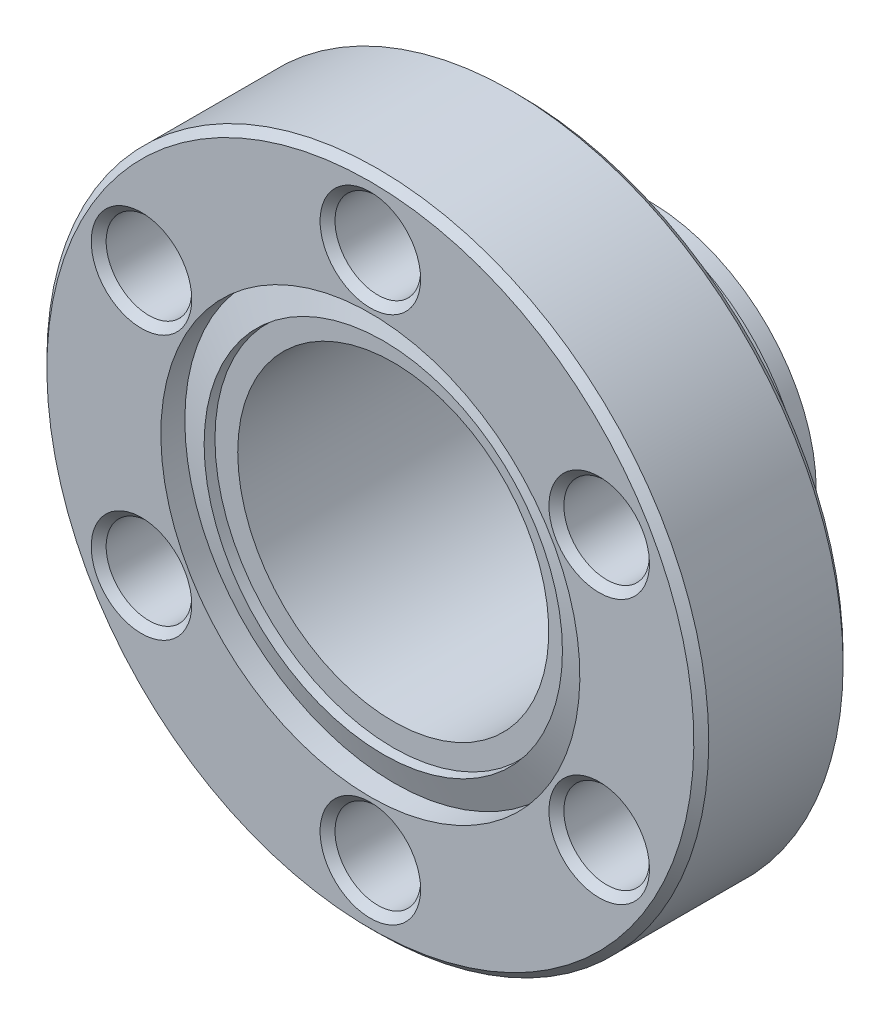
ISO-10303-21;
HEADER;
FILE_DESCRIPTION(('STEP AP214'),'2;1');
FILE_NAME('part.step','',(''),(''),'','','');
FILE_SCHEMA(('AUTOMOTIVE_DESIGN { 1 0 10303 214 1 1 1 1 }'));
ENDSEC;
DATA;
#1=APPLICATION_CONTEXT('core data for automotive mechanical design processes');
#2=APPLICATION_PROTOCOL_DEFINITION('international standard','automotive_design',2000,#1);
#3=PRODUCT_CONTEXT('',#1,'mechanical');
#4=PRODUCT('Part','Part','',(#3));
#5=PRODUCT_RELATED_PRODUCT_CATEGORY('part','',(#4));
#6=PRODUCT_DEFINITION_FORMATION('','',#4);
#7=PRODUCT_DEFINITION_CONTEXT('part definition',#1,'design');
#8=PRODUCT_DEFINITION('design','',#6,#7);
#9=PRODUCT_DEFINITION_SHAPE('','',#8);
#10=(LENGTH_UNIT() NAMED_UNIT(*) SI_UNIT(.MILLI.,.METRE.));
#11=(NAMED_UNIT(*) PLANE_ANGLE_UNIT() SI_UNIT($,.RADIAN.));
#12=(NAMED_UNIT(*) SI_UNIT($,.STERADIAN.) SOLID_ANGLE_UNIT());
#13=UNCERTAINTY_MEASURE_WITH_UNIT(LENGTH_MEASURE(1.E-05),#10,'distance_accuracy_value','');
#14=(GEOMETRIC_REPRESENTATION_CONTEXT(3) GLOBAL_UNCERTAINTY_ASSIGNED_CONTEXT((#13)) GLOBAL_UNIT_ASSIGNED_CONTEXT((#10,
#11,#12)) REPRESENTATION_CONTEXT('',''));
#15=CARTESIAN_POINT('',(0.,0.,0.));
#16=DIRECTION('',(0.,0.,1.));
#17=DIRECTION('',(1.,0.,0.));
#18=AXIS2_PLACEMENT_3D('',#15,#16,#17);
#19=CARTESIAN_POINT('',(0.,125.,106.381600000004));
#20=DIRECTION('',(0.,0.,1.));
#21=DIRECTION('',(1.,0.,0.));
#22=AXIS2_PLACEMENT_3D('',#19,#20,#21);
#23=CONICAL_SURFACE('',#22,9.09955575892884,0.0872664626014899);
#24=CARTESIAN_POINT('',(0.,125.,106.889599999987));
#25=DIRECTION('',(0.,0.,1.));
#26=DIRECTION('',(-1.,0.,0.));
#27=AXIS2_PLACEMENT_3D('',#24,#25,#26);
#28=CIRCLE('',#27,9.14399999999961);
#29=CARTESIAN_POINT('',(-9.14399999999961,125.,106.889599999987));
#30=VERTEX_POINT('',#29);
#31=EDGE_CURVE('E30',#30,#30,#28,.T.);
#32=ORIENTED_EDGE('',*,*,#31,.T.);
#33=EDGE_LOOP('',(#32));
#34=FACE_BOUND('',#33,.T.);
#35=CARTESIAN_POINT('',(0.,125.,106.381600000004));
#36=DIRECTION('',(0.,0.,1.));
#37=DIRECTION('',(1.,0.,0.));
#38=AXIS2_PLACEMENT_3D('',#35,#36,#37);
#39=CIRCLE('',#38,9.09955575892884);
#40=CARTESIAN_POINT('',(9.09955575892884,125.,106.381600000004));
#41=VERTEX_POINT('',#40);
#42=EDGE_CURVE('E18',#41,#41,#39,.T.);
#43=ORIENTED_EDGE('',*,*,#42,.F.);
#44=EDGE_LOOP('',(#43));
#45=FACE_BOUND('',#44,.T.);
#46=ADVANCED_FACE('F14',(#34,#45),#23,.F.);
#47=CARTESIAN_POINT('',(0.,125.,106.325664519013));
#48=DIRECTION('',(0.,0.,-1.));
#49=DIRECTION('',(-1.,0.,0.));
#50=AXIS2_PLACEMENT_3D('',#47,#48,#49);
#51=CONICAL_SURFACE('',#50,10.6934000000004,1.22173047639554);
#52=CARTESIAN_POINT('',(0.,125.,106.325664519065));
#53=DIRECTION('',(0.,0.,1.));
#54=DIRECTION('',(-1.,0.,0.));
#55=AXIS2_PLACEMENT_3D('',#52,#53,#54);
#56=CIRCLE('',#55,10.6934);
#57=CARTESIAN_POINT('',(-10.6934,125.,106.325664519065));
#58=VERTEX_POINT('',#57);
#59=EDGE_CURVE('E91',#58,#58,#56,.F.);
#60=ORIENTED_EDGE('',*,*,#59,.F.);
#61=EDGE_LOOP('',(#60));
#62=FACE_BOUND('',#61,.T.);
#63=ORIENTED_EDGE('',*,*,#31,.F.);
#64=EDGE_LOOP('',(#63));
#65=FACE_BOUND('',#64,.T.);
#66=ADVANCED_FACE('F432',(#62,#65),#51,.T.);
#67=CARTESIAN_POINT('',(9.463537989286,134.4635379893,106.3816));
#68=DIRECTION('',(0.,0.,1.));
#69=DIRECTION('',(-1.,0.,0.));
#70=AXIS2_PLACEMENT_3D('',#67,#68,#69);
#71=PLANE('',#70);
#72=CARTESIAN_POINT('',(0.,125.,106.3816));
#73=DIRECTION('',(0.,0.,-1.));
#74=DIRECTION('',(-1.,0.,0.));
#75=AXIS2_PLACEMENT_3D('',#72,#73,#74);
#76=CIRCLE('',#75,7.9375);
#77=CARTESIAN_POINT('',(-7.9375,125.,106.3816));
#78=VERTEX_POINT('',#77);
#79=EDGE_CURVE('E89',#78,#78,#76,.F.);
#80=ORIENTED_EDGE('',*,*,#79,.F.);
#81=EDGE_LOOP('',(#80));
#82=FACE_BOUND('',#81,.T.);
#83=ORIENTED_EDGE('',*,*,#42,.T.);
#84=EDGE_LOOP('',(#83));
#85=FACE_BOUND('',#84,.T.);
#86=ADVANCED_FACE('F424',(#82,#85),#71,.T.);
#87=CARTESIAN_POINT('',(0.,125.,106.325664519065));
#88=DIRECTION('',(0.,0.,1.));
#89=DIRECTION('',(0.,-1.,0.));
#90=AXIS2_PLACEMENT_3D('',#87,#88,#89);
#91=CYLINDRICAL_SURFACE('',#90,10.6934);
#92=ORIENTED_EDGE('',*,*,#59,.T.);
#93=EDGE_LOOP('',(#92));
#94=FACE_BOUND('',#93,.T.);
#95=CARTESIAN_POINT('',(0.,125.,107.550000000035));
#96=DIRECTION('',(0.,0.,1.));
#97=DIRECTION('',(0.,-1.,0.));
#98=AXIS2_PLACEMENT_3D('',#95,#96,#97);
#99=CIRCLE('',#98,10.6934);
#100=CARTESIAN_POINT('',(0.,114.3066,107.550000000035));
#101=VERTEX_POINT('',#100);
#102=EDGE_CURVE('E87',#101,#101,#99,.F.);
#103=ORIENTED_EDGE('',*,*,#102,.F.);
#104=EDGE_LOOP('',(#103));
#105=FACE_BOUND('',#104,.T.);
#106=ADVANCED_FACE('F415',(#94,#105),#91,.F.);
#107=CARTESIAN_POINT('',(0.,125.,106.3816));
#108=DIRECTION('',(0.,0.,-1.));
#109=DIRECTION('',(-1.,0.,0.));
#110=AXIS2_PLACEMENT_3D('',#107,#108,#109);
#111=CYLINDRICAL_SURFACE('',#110,7.9375);
#112=CARTESIAN_POINT('',(0.,125.,93.3260000000004));
#113=DIRECTION('',(0.,0.,-1.));
#114=DIRECTION('',(-1.,0.,0.));
#115=AXIS2_PLACEMENT_3D('',#112,#113,#114);
#116=CIRCLE('',#115,7.9375);
#117=CARTESIAN_POINT('',(-7.9375,125.,93.3260000000004));
#118=VERTEX_POINT('',#117);
#119=EDGE_CURVE('E84',#118,#118,#116,.F.);
#120=ORIENTED_EDGE('',*,*,#119,.F.);
#121=EDGE_LOOP('',(#120));
#122=FACE_BOUND('',#121,.T.);
#123=ORIENTED_EDGE('',*,*,#79,.T.);
#124=EDGE_LOOP('',(#123));
#125=FACE_BOUND('',#124,.T.);
#126=ADVANCED_FACE('F406',(#122,#125),#111,.F.);
#127=CARTESIAN_POINT('',(-17.1704,107.8296,107.55));
#128=DIRECTION('',(0.,0.,1.));
#129=DIRECTION('',(1.,0.,0.));
#130=AXIS2_PLACEMENT_3D('',#127,#128,#129);
#131=PLANE('',#130);
#132=CARTESIAN_POINT('',(-11.680431031,131.7437,107.549999999991));
#133=DIRECTION('',(0.,0.,1.));
#134=DIRECTION('',(1.,0.,0.));
#135=AXIS2_PLACEMENT_3D('',#132,#133,#134);
#136=CIRCLE('',#135,2.56539999999819);
#137=CARTESIAN_POINT('',(-9.11503103100182,131.7437,107.549999999991));
#138=VERTEX_POINT('',#137);
#139=EDGE_CURVE('E63',#138,#138,#136,.T.);
#140=ORIENTED_EDGE('',*,*,#139,.F.);
#141=EDGE_LOOP('',(#140));
#142=FACE_BOUND('',#141,.T.);
#143=CARTESIAN_POINT('',(0.,138.4874,107.549999999991));
#144=DIRECTION('',(0.,0.,1.));
#145=DIRECTION('',(1.,0.,0.));
#146=AXIS2_PLACEMENT_3D('',#143,#144,#145);
#147=CIRCLE('',#146,2.56540000000019);
#148=CARTESIAN_POINT('',(2.56540000000019,138.4874,107.549999999991));
#149=VERTEX_POINT('',#148);
#150=EDGE_CURVE('E66',#149,#149,#147,.T.);
#151=ORIENTED_EDGE('',*,*,#150,.F.);
#152=EDGE_LOOP('',(#151));
#153=FACE_BOUND('',#152,.T.);
#154=CARTESIAN_POINT('',(11.680431031,131.7437,107.549999999991));
#155=DIRECTION('',(0.,0.,1.));
#156=DIRECTION('',(0.,-1.,0.));
#157=AXIS2_PLACEMENT_3D('',#154,#155,#156);
#158=CIRCLE('',#157,2.56539999999937);
#159=CARTESIAN_POINT('',(11.680431031,129.178300000001,107.549999999991));
#160=VERTEX_POINT('',#159);
#161=EDGE_CURVE('E69',#160,#160,#158,.T.);
#162=ORIENTED_EDGE('',*,*,#161,.F.);
#163=EDGE_LOOP('',(#162));
#164=FACE_BOUND('',#163,.T.);
#165=CARTESIAN_POINT('',(11.680431031,118.2563,107.549999999991));
#166=DIRECTION('',(0.,0.,1.));
#167=DIRECTION('',(0.,-1.,0.));
#168=AXIS2_PLACEMENT_3D('',#165,#166,#167);
#169=CIRCLE('',#168,2.56539999999937);
#170=CARTESIAN_POINT('',(11.680431031,115.690900000001,107.549999999991));
#171=VERTEX_POINT('',#170);
#172=EDGE_CURVE('E72',#171,#171,#169,.T.);
#173=ORIENTED_EDGE('',*,*,#172,.F.);
#174=EDGE_LOOP('',(#173));
#175=FACE_BOUND('',#174,.T.);
#176=CARTESIAN_POINT('',(0.,111.5126,107.549999999991));
#177=DIRECTION('',(0.,0.,1.));
#178=DIRECTION('',(1.,0.,0.));
#179=AXIS2_PLACEMENT_3D('',#176,#177,#178);
#180=CIRCLE('',#179,2.56540000000019);
#181=CARTESIAN_POINT('',(2.56540000000019,111.5126,107.549999999991));
#182=VERTEX_POINT('',#181);
#183=EDGE_CURVE('E75',#182,#182,#180,.T.);
#184=ORIENTED_EDGE('',*,*,#183,.F.);
#185=EDGE_LOOP('',(#184));
#186=FACE_BOUND('',#185,.T.);
#187=CARTESIAN_POINT('',(-11.680431031,118.2563,107.549999999991));
#188=DIRECTION('',(0.,0.,1.));
#189=DIRECTION('',(1.,0.,0.));
#190=AXIS2_PLACEMENT_3D('',#187,#188,#189);
#191=CIRCLE('',#190,2.56539999999819);
#192=CARTESIAN_POINT('',(-9.11503103100182,118.2563,107.549999999991));
#193=VERTEX_POINT('',#192);
#194=EDGE_CURVE('E78',#193,#193,#191,.T.);
#195=ORIENTED_EDGE('',*,*,#194,.F.);
#196=EDGE_LOOP('',(#195));
#197=FACE_BOUND('',#196,.T.);
#198=ORIENTED_EDGE('',*,*,#102,.T.);
#199=EDGE_LOOP('',(#198));
#200=FACE_BOUND('',#199,.T.);
#201=CARTESIAN_POINT('',(0.,125.,107.549999999991));
#202=DIRECTION('',(0.,0.,-1.));
#203=DIRECTION('',(0.,1.,0.));
#204=AXIS2_PLACEMENT_3D('',#201,#202,#203);
#205=CIRCLE('',#204,16.5100000000006);
#206=CARTESIAN_POINT('',(0.,141.510000000001,107.549999999991));
#207=VERTEX_POINT('',#206);
#208=EDGE_CURVE('E81',#207,#207,#205,.F.);
#209=ORIENTED_EDGE('',*,*,#208,.T.);
#210=EDGE_LOOP('',(#209));
#211=FACE_BOUND('',#210,.T.);
#212=ADVANCED_FACE('F397',(#142,#153,#164,#175,#186,#197,#200,#211),#131,.T.);
#213=CARTESIAN_POINT('',(8.875776,116.1153310946,93.326));
#214=DIRECTION('',(0.,0.,-1.));
#215=DIRECTION('',(-1.,0.,0.));
#216=AXIS2_PLACEMENT_3D('',#213,#214,#215);
#217=PLANE('',#216);
#218=ORIENTED_EDGE('',*,*,#119,.T.);
#219=EDGE_LOOP('',(#218));
#220=FACE_BOUND('',#219,.T.);
#221=CARTESIAN_POINT('',(0.,125.,93.3260000000046));
#222=DIRECTION('',(0.,0.,1.));
#223=DIRECTION('',(1.,0.,0.));
#224=AXIS2_PLACEMENT_3D('',#221,#222,#223);
#225=CIRCLE('',#224,8.5344);
#226=CARTESIAN_POINT('',(8.5344,125.,93.3260000000046));
#227=VERTEX_POINT('',#226);
#228=EDGE_CURVE('E59',#227,#227,#225,.F.);
#229=ORIENTED_EDGE('',*,*,#228,.T.);
#230=EDGE_LOOP('',(#229));
#231=FACE_BOUND('',#230,.T.);
#232=ADVANCED_FACE('F388',(#220,#231),#217,.T.);
#233=CARTESIAN_POINT('',(0.,125.,107.169000000009));
#234=DIRECTION('',(0.,0.,-1.));
#235=DIRECTION('',(0.,1.,0.));
#236=AXIS2_PLACEMENT_3D('',#233,#234,#235);
#237=CONICAL_SURFACE('',#236,16.8909999999994,0.785398163418921);
#238=CARTESIAN_POINT('',(0.,125.,107.169));
#239=DIRECTION('',(0.,0.,1.));
#240=DIRECTION('',(1.,0.,0.));
#241=AXIS2_PLACEMENT_3D('',#238,#239,#240);
#242=CIRCLE('',#241,16.891);
#243=CARTESIAN_POINT('',(16.891,125.,107.169));
#244=VERTEX_POINT('',#243);
#245=EDGE_CURVE('E62',#244,#244,#242,.T.);
#246=ORIENTED_EDGE('',*,*,#245,.T.);
#247=EDGE_LOOP('',(#246));
#248=FACE_BOUND('',#247,.T.);
#249=ORIENTED_EDGE('',*,*,#208,.F.);
#250=EDGE_LOOP('',(#249));
#251=FACE_BOUND('',#250,.T.);
#252=ADVANCED_FACE('F379',(#248,#251),#237,.T.);
#253=CARTESIAN_POINT('',(-11.680431031,118.2563,107.549999999991));
#254=DIRECTION('',(0.,0.,1.));
#255=DIRECTION('',(1.,0.,0.));
#256=AXIS2_PLACEMENT_3D('',#253,#254,#255);
#257=CONICAL_SURFACE('',#256,2.56539999999818,0.785398163421065);
#258=CARTESIAN_POINT('',(-11.680431031,118.2563,107.169));
#259=DIRECTION('',(0.,0.,-1.));
#260=DIRECTION('',(1.,0.,0.));
#261=AXIS2_PLACEMENT_3D('',#258,#259,#260);
#262=CIRCLE('',#261,2.184399999998);
#263=CARTESIAN_POINT('',(-9.496031031002,118.2563,107.169));
#264=VERTEX_POINT('',#263);
#265=EDGE_CURVE('E101',#264,#264,#262,.F.);
#266=ORIENTED_EDGE('',*,*,#265,.F.);
#267=EDGE_LOOP('',(#266));
#268=FACE_BOUND('',#267,.T.);
#269=ORIENTED_EDGE('',*,*,#194,.T.);
#270=EDGE_LOOP('',(#269));
#271=FACE_BOUND('',#270,.T.);
#272=ADVANCED_FACE('F370',(#268,#271),#257,.F.);
#273=CARTESIAN_POINT('',(0.,111.5126,107.549999999991));
#274=DIRECTION('',(0.,0.,1.));
#275=DIRECTION('',(1.,0.,0.));
#276=AXIS2_PLACEMENT_3D('',#273,#274,#275);
#277=CONICAL_SURFACE('',#276,2.56540000000018,0.78539816342107);
#278=CARTESIAN_POINT('',(0.,111.5126,107.169));
#279=DIRECTION('',(0.,0.,-1.));
#280=DIRECTION('',(1.,0.,0.));
#281=AXIS2_PLACEMENT_3D('',#278,#279,#280);
#282=CIRCLE('',#281,2.1844);
#283=CARTESIAN_POINT('',(2.1844,111.5126,107.169));
#284=VERTEX_POINT('',#283);
#285=EDGE_CURVE('E104',#284,#284,#282,.F.);
#286=ORIENTED_EDGE('',*,*,#285,.F.);
#287=EDGE_LOOP('',(#286));
#288=FACE_BOUND('',#287,.T.);
#289=ORIENTED_EDGE('',*,*,#183,.T.);
#290=EDGE_LOOP('',(#289));
#291=FACE_BOUND('',#290,.T.);
#292=ADVANCED_FACE('F361',(#288,#291),#277,.F.);
#293=CARTESIAN_POINT('',(11.680431031,118.2563,107.549999999991));
#294=DIRECTION('',(0.,0.,1.));
#295=DIRECTION('',(0.,-1.,0.));
#296=AXIS2_PLACEMENT_3D('',#293,#294,#295);
#297=CONICAL_SURFACE('',#296,2.56539999999937,0.785398163418905);
#298=CARTESIAN_POINT('',(11.680431031,118.2563,107.169));
#299=DIRECTION('',(0.,0.,-1.));
#300=DIRECTION('',(1.,0.,0.));
#301=AXIS2_PLACEMENT_3D('',#298,#299,#300);
#302=CIRCLE('',#301,2.1844);
#303=CARTESIAN_POINT('',(13.864831031,118.2563,107.169));
#304=VERTEX_POINT('',#303);
#305=EDGE_CURVE('E107',#304,#304,#302,.F.);
#306=ORIENTED_EDGE('',*,*,#305,.F.);
#307=EDGE_LOOP('',(#306));
#308=FACE_BOUND('',#307,.T.);
#309=ORIENTED_EDGE('',*,*,#172,.T.);
#310=EDGE_LOOP('',(#309));
#311=FACE_BOUND('',#310,.T.);
#312=ADVANCED_FACE('F352',(#308,#311),#297,.F.);
#313=CARTESIAN_POINT('',(11.680431031,131.7437,107.549999999991));
#314=DIRECTION('',(0.,0.,1.));
#315=DIRECTION('',(0.,-1.,0.));
#316=AXIS2_PLACEMENT_3D('',#313,#314,#315);
#317=CONICAL_SURFACE('',#316,2.56539999999937,0.785398163418905);
#318=CARTESIAN_POINT('',(11.680431031,131.7437,107.169));
#319=DIRECTION('',(0.,0.,-1.));
#320=DIRECTION('',(1.,0.,0.));
#321=AXIS2_PLACEMENT_3D('',#318,#319,#320);
#322=CIRCLE('',#321,2.1844);
#323=CARTESIAN_POINT('',(13.864831031,131.7437,107.169));
#324=VERTEX_POINT('',#323);
#325=EDGE_CURVE('E110',#324,#324,#322,.F.);
#326=ORIENTED_EDGE('',*,*,#325,.F.);
#327=EDGE_LOOP('',(#326));
#328=FACE_BOUND('',#327,.T.);
#329=ORIENTED_EDGE('',*,*,#161,.T.);
#330=EDGE_LOOP('',(#329));
#331=FACE_BOUND('',#330,.T.);
#332=ADVANCED_FACE('F343',(#328,#331),#317,.F.);
#333=CARTESIAN_POINT('',(0.,138.4874,107.549999999991));
#334=DIRECTION('',(0.,0.,1.));
#335=DIRECTION('',(1.,0.,0.));
#336=AXIS2_PLACEMENT_3D('',#333,#334,#335);
#337=CONICAL_SURFACE('',#336,2.56540000000018,0.78539816342107);
#338=CARTESIAN_POINT('',(0.,138.4874,107.169));
#339=DIRECTION('',(0.,0.,-1.));
#340=DIRECTION('',(1.,0.,0.));
#341=AXIS2_PLACEMENT_3D('',#338,#339,#340);
#342=CIRCLE('',#341,2.1844);
#343=CARTESIAN_POINT('',(2.1844,138.4874,107.169));
#344=VERTEX_POINT('',#343);
#345=EDGE_CURVE('E113',#344,#344,#342,.F.);
#346=ORIENTED_EDGE('',*,*,#345,.F.);
#347=EDGE_LOOP('',(#346));
#348=FACE_BOUND('',#347,.T.);
#349=ORIENTED_EDGE('',*,*,#150,.T.);
#350=EDGE_LOOP('',(#349));
#351=FACE_BOUND('',#350,.T.);
#352=ADVANCED_FACE('F334',(#348,#351),#337,.F.);
#353=CARTESIAN_POINT('',(-11.680431031,131.7437,107.549999999991));
#354=DIRECTION('',(0.,0.,1.));
#355=DIRECTION('',(1.,0.,0.));
#356=AXIS2_PLACEMENT_3D('',#353,#354,#355);
#357=CONICAL_SURFACE('',#356,2.56539999999818,0.785398163421065);
#358=CARTESIAN_POINT('',(-11.680431031,131.7437,107.169));
#359=DIRECTION('',(0.,0.,-1.));
#360=DIRECTION('',(1.,0.,0.));
#361=AXIS2_PLACEMENT_3D('',#358,#359,#360);
#362=CIRCLE('',#361,2.184399999998);
#363=CARTESIAN_POINT('',(-9.496031031002,131.7437,107.169));
#364=VERTEX_POINT('',#363);
#365=EDGE_CURVE('E58',#364,#364,#362,.F.);
#366=ORIENTED_EDGE('',*,*,#365,.F.);
#367=EDGE_LOOP('',(#366));
#368=FACE_BOUND('',#367,.T.);
#369=ORIENTED_EDGE('',*,*,#139,.T.);
#370=EDGE_LOOP('',(#369));
#371=FACE_BOUND('',#370,.T.);
#372=ADVANCED_FACE('F325',(#368,#371),#357,.F.);
#373=CARTESIAN_POINT('',(0.,125.,93.3260000000046));
#374=DIRECTION('',(0.,0.,1.));
#375=DIRECTION('',(1.,0.,0.));
#376=AXIS2_PLACEMENT_3D('',#373,#374,#375);
#377=CYLINDRICAL_SURFACE('',#376,8.5344);
#378=CARTESIAN_POINT('',(0.,125.,94.8499999999953));
#379=DIRECTION('',(0.,0.,1.));
#380=DIRECTION('',(1.,0.,0.));
#381=AXIS2_PLACEMENT_3D('',#378,#379,#380);
#382=CIRCLE('',#381,8.5344);
#383=CARTESIAN_POINT('',(8.5344,125.,94.8499999999953));
#384=VERTEX_POINT('',#383);
#385=EDGE_CURVE('E54',#384,#384,#382,.F.);
#386=ORIENTED_EDGE('',*,*,#385,.T.);
#387=EDGE_LOOP('',(#386));
#388=FACE_BOUND('',#387,.T.);
#389=ORIENTED_EDGE('',*,*,#228,.F.);
#390=EDGE_LOOP('',(#389));
#391=FACE_BOUND('',#390,.T.);
#392=ADVANCED_FACE('F316',(#388,#391),#377,.T.);
#393=CARTESIAN_POINT('',(0.,125.,100.311));
#394=DIRECTION('',(0.,0.,1.));
#395=DIRECTION('',(1.,0.,0.));
#396=AXIS2_PLACEMENT_3D('',#393,#394,#395);
#397=CYLINDRICAL_SURFACE('',#396,16.891);
#398=ORIENTED_EDGE('',*,*,#245,.F.);
#399=EDGE_LOOP('',(#398));
#400=FACE_BOUND('',#399,.T.);
#401=CARTESIAN_POINT('',(0.,125.,100.31099999999));
#402=DIRECTION('',(0.,0.,1.));
#403=DIRECTION('',(1.,0.,0.));
#404=AXIS2_PLACEMENT_3D('',#401,#402,#403);
#405=CIRCLE('',#404,16.8909999999994);
#406=CARTESIAN_POINT('',(16.8909999999994,125.,100.31099999999));
#407=VERTEX_POINT('',#406);
#408=EDGE_CURVE('E57',#407,#407,#405,.T.);
#409=ORIENTED_EDGE('',*,*,#408,.T.);
#410=EDGE_LOOP('',(#409));
#411=FACE_BOUND('',#410,.T.);
#412=ADVANCED_FACE('F307',(#400,#411),#397,.T.);
#413=CARTESIAN_POINT('',(-11.680431031,118.2563,107.169));
#414=DIRECTION('',(0.,0.,-1.));
#415=DIRECTION('',(0.,1.,0.));
#416=AXIS2_PLACEMENT_3D('',#413,#414,#415);
#417=CYLINDRICAL_SURFACE('',#416,2.184399999998);
#418=ORIENTED_EDGE('',*,*,#265,.T.);
#419=EDGE_LOOP('',(#418));
#420=FACE_BOUND('',#419,.T.);
#421=CARTESIAN_POINT('',(-11.680431031,118.2563,100.31099999999));
#422=DIRECTION('',(0.,0.,-1.));
#423=DIRECTION('',(1.,0.,0.));
#424=AXIS2_PLACEMENT_3D('',#421,#422,#423);
#425=CIRCLE('',#424,2.18439999999782);
#426=CARTESIAN_POINT('',(-9.49603103100218,118.2563,100.31099999999));
#427=VERTEX_POINT('',#426);
#428=EDGE_CURVE('E120',#427,#427,#425,.F.);
#429=ORIENTED_EDGE('',*,*,#428,.F.);
#430=EDGE_LOOP('',(#429));
#431=FACE_BOUND('',#430,.T.);
#432=ADVANCED_FACE('F298',(#420,#431),#417,.F.);
#433=CARTESIAN_POINT('',(0.,111.5126,107.169));
#434=DIRECTION('',(0.,0.,-1.));
#435=DIRECTION('',(0.,1.,0.));
#436=AXIS2_PLACEMENT_3D('',#433,#434,#435);
#437=CYLINDRICAL_SURFACE('',#436,2.1844);
#438=ORIENTED_EDGE('',*,*,#285,.T.);
#439=EDGE_LOOP('',(#438));
#440=FACE_BOUND('',#439,.T.);
#441=CARTESIAN_POINT('',(0.,111.5126,100.31099999999));
#442=DIRECTION('',(0.,0.,-1.));
#443=DIRECTION('',(1.,0.,0.));
#444=AXIS2_PLACEMENT_3D('',#441,#442,#443);
#445=CIRCLE('',#444,2.18439999999982);
#446=CARTESIAN_POINT('',(2.18439999999982,111.5126,100.31099999999));
#447=VERTEX_POINT('',#446);
#448=EDGE_CURVE('E123',#447,#447,#445,.F.);
#449=ORIENTED_EDGE('',*,*,#448,.F.);
#450=EDGE_LOOP('',(#449));
#451=FACE_BOUND('',#450,.T.);
#452=ADVANCED_FACE('F289',(#440,#451),#437,.F.);
#453=CARTESIAN_POINT('',(11.680431031,118.2563,107.169));
#454=DIRECTION('',(0.,0.,-1.));
#455=DIRECTION('',(0.,1.,0.));
#456=AXIS2_PLACEMENT_3D('',#453,#454,#455);
#457=CYLINDRICAL_SURFACE('',#456,2.1844);
#458=ORIENTED_EDGE('',*,*,#305,.T.);
#459=EDGE_LOOP('',(#458));
#460=FACE_BOUND('',#459,.T.);
#461=CARTESIAN_POINT('',(11.680431031,118.2563,100.31099999999));
#462=DIRECTION('',(0.,0.,-1.));
#463=DIRECTION('',(1.,0.,0.));
#464=AXIS2_PLACEMENT_3D('',#461,#462,#463);
#465=CIRCLE('',#464,2.18440000000063);
#466=CARTESIAN_POINT('',(13.8648310310006,118.2563,100.31099999999));
#467=VERTEX_POINT('',#466);
#468=EDGE_CURVE('E126',#467,#467,#465,.F.);
#469=ORIENTED_EDGE('',*,*,#468,.F.);
#470=EDGE_LOOP('',(#469));
#471=FACE_BOUND('',#470,.T.);
#472=ADVANCED_FACE('F280',(#460,#471),#457,.F.);
#473=CARTESIAN_POINT('',(11.680431031,131.7437,107.169));
#474=DIRECTION('',(0.,0.,-1.));
#475=DIRECTION('',(0.,1.,0.));
#476=AXIS2_PLACEMENT_3D('',#473,#474,#475);
#477=CYLINDRICAL_SURFACE('',#476,2.1844);
#478=ORIENTED_EDGE('',*,*,#325,.T.);
#479=EDGE_LOOP('',(#478));
#480=FACE_BOUND('',#479,.T.);
#481=CARTESIAN_POINT('',(11.680431031,131.7437,100.31099999999));
#482=DIRECTION('',(0.,0.,-1.));
#483=DIRECTION('',(1.,0.,0.));
#484=AXIS2_PLACEMENT_3D('',#481,#482,#483);
#485=CIRCLE('',#484,2.18440000000063);
#486=CARTESIAN_POINT('',(13.8648310310006,131.7437,100.31099999999));
#487=VERTEX_POINT('',#486);
#488=EDGE_CURVE('E129',#487,#487,#485,.F.);
#489=ORIENTED_EDGE('',*,*,#488,.F.);
#490=EDGE_LOOP('',(#489));
#491=FACE_BOUND('',#490,.T.);
#492=ADVANCED_FACE('F154',(#480,#491),#477,.F.);
#493=CARTESIAN_POINT('',(0.,138.4874,107.169));
#494=DIRECTION('',(0.,0.,-1.));
#495=DIRECTION('',(0.,1.,0.));
#496=AXIS2_PLACEMENT_3D('',#493,#494,#495);
#497=CYLINDRICAL_SURFACE('',#496,2.1844);
#498=ORIENTED_EDGE('',*,*,#345,.T.);
#499=EDGE_LOOP('',(#498));
#500=FACE_BOUND('',#499,.T.);
#501=CARTESIAN_POINT('',(0.,138.4874,100.31099999999));
#502=DIRECTION('',(0.,0.,-1.));
#503=DIRECTION('',(1.,0.,0.));
#504=AXIS2_PLACEMENT_3D('',#501,#502,#503);
#505=CIRCLE('',#504,2.18439999999982);
#506=CARTESIAN_POINT('',(2.18439999999982,138.4874,100.31099999999));
#507=VERTEX_POINT('',#506);
#508=EDGE_CURVE('E132',#507,#507,#505,.F.);
#509=ORIENTED_EDGE('',*,*,#508,.F.);
#510=EDGE_LOOP('',(#509));
#511=FACE_BOUND('',#510,.T.);
#512=ADVANCED_FACE('F144',(#500,#511),#497,.F.);
#513=CARTESIAN_POINT('',(-11.680431031,131.7437,107.169));
#514=DIRECTION('',(0.,0.,-1.));
#515=DIRECTION('',(0.,1.,0.));
#516=AXIS2_PLACEMENT_3D('',#513,#514,#515);
#517=CYLINDRICAL_SURFACE('',#516,2.184399999998);
#518=ORIENTED_EDGE('',*,*,#365,.T.);
#519=EDGE_LOOP('',(#518));
#520=FACE_BOUND('',#519,.T.);
#521=CARTESIAN_POINT('',(-11.680431031,131.7437,100.31099999999));
#522=DIRECTION('',(0.,0.,-1.));
#523=DIRECTION('',(1.,0.,0.));
#524=AXIS2_PLACEMENT_3D('',#521,#522,#523);
#525=CIRCLE('',#524,2.18439999999782);
#526=CARTESIAN_POINT('',(-9.49603103100218,131.7437,100.31099999999));
#527=VERTEX_POINT('',#526);
#528=EDGE_CURVE('E53',#527,#527,#525,.F.);
#529=ORIENTED_EDGE('',*,*,#528,.F.);
#530=EDGE_LOOP('',(#529));
#531=FACE_BOUND('',#530,.T.);
#532=ADVANCED_FACE('F141',(#520,#531),#517,.F.);
#533=CARTESIAN_POINT('',(9.906,134.906,94.85));
#534=DIRECTION('',(0.,0.,1.));
#535=DIRECTION('',(-1.,0.,0.));
#536=AXIS2_PLACEMENT_3D('',#533,#534,#535);
#537=PLANE('',#536);
#538=ORIENTED_EDGE('',*,*,#385,.F.);
#539=EDGE_LOOP('',(#538));
#540=FACE_BOUND('',#539,.T.);
#541=CARTESIAN_POINT('',(0.,125.,94.8500000000002));
#542=DIRECTION('',(0.,0.,-1.));
#543=DIRECTION('',(0.,1.,0.));
#544=AXIS2_PLACEMENT_3D('',#541,#542,#543);
#545=CIRCLE('',#544,9.525);
#546=CARTESIAN_POINT('',(0.,134.525,94.8500000000002));
#547=VERTEX_POINT('',#546);
#548=EDGE_CURVE('E50',#547,#547,#545,.T.);
#549=ORIENTED_EDGE('',*,*,#548,.T.);
#550=EDGE_LOOP('',(#549));
#551=FACE_BOUND('',#550,.T.);
#552=ADVANCED_FACE('F143',(#540,#551),#537,.F.);
#553=CARTESIAN_POINT('',(0.,125.,99.9299999999997));
#554=DIRECTION('',(0.,0.,1.));
#555=DIRECTION('',(1.,0.,0.));
#556=AXIS2_PLACEMENT_3D('',#553,#554,#555);
#557=CONICAL_SURFACE('',#556,16.5100000000006,0.785398163408157);
#558=ORIENTED_EDGE('',*,*,#408,.F.);
#559=EDGE_LOOP('',(#558));
#560=FACE_BOUND('',#559,.T.);
#561=CARTESIAN_POINT('',(0.,125.,99.9299999999997));
#562=DIRECTION('',(0.,0.,1.));
#563=DIRECTION('',(1.,0.,0.));
#564=AXIS2_PLACEMENT_3D('',#561,#562,#563);
#565=CIRCLE('',#564,16.5100000000006);
#566=CARTESIAN_POINT('',(16.5100000000006,125.,99.9299999999997));
#567=VERTEX_POINT('',#566);
#568=EDGE_CURVE('E47',#567,#567,#565,.T.);
#569=ORIENTED_EDGE('',*,*,#568,.T.);
#570=EDGE_LOOP('',(#569));
#571=FACE_BOUND('',#570,.T.);
#572=ADVANCED_FACE('F152',(#560,#571),#557,.T.);
#573=CARTESIAN_POINT('',(-11.680431031,118.2563,100.31099999999));
#574=DIRECTION('',(0.,0.,-1.));
#575=DIRECTION('',(0.,1.,0.));
#576=AXIS2_PLACEMENT_3D('',#573,#574,#575);
#577=CONICAL_SURFACE('',#576,2.18439999999781,0.785398163410302);
#578=ORIENTED_EDGE('',*,*,#428,.T.);
#579=EDGE_LOOP('',(#578));
#580=FACE_BOUND('',#579,.T.);
#581=CARTESIAN_POINT('',(-11.680431031,118.2563,99.9299999999997));
#582=DIRECTION('',(0.,0.,-1.));
#583=DIRECTION('',(0.,1.,0.));
#584=AXIS2_PLACEMENT_3D('',#581,#582,#583);
#585=CIRCLE('',#584,2.56539999999819);
#586=CARTESIAN_POINT('',(-11.680431031,120.821699999998,99.9299999999997));
#587=VERTEX_POINT('',#586);
#588=EDGE_CURVE('E44',#587,#587,#585,.T.);
#589=ORIENTED_EDGE('',*,*,#588,.T.);
#590=EDGE_LOOP('',(#589));
#591=FACE_BOUND('',#590,.T.);
#592=ADVANCED_FACE('F181',(#580,#591),#577,.F.);
#593=CARTESIAN_POINT('',(0.,111.5126,100.31099999999));
#594=DIRECTION('',(0.,0.,-1.));
#595=DIRECTION('',(0.,1.,0.));
#596=AXIS2_PLACEMENT_3D('',#593,#594,#595);
#597=CONICAL_SURFACE('',#596,2.18439999999981,0.785398163410311);
#598=ORIENTED_EDGE('',*,*,#448,.T.);
#599=EDGE_LOOP('',(#598));
#600=FACE_BOUND('',#599,.T.);
#601=CARTESIAN_POINT('',(0.,111.5126,99.9299999999997));
#602=DIRECTION('',(0.,0.,-1.));
#603=DIRECTION('',(0.,1.,0.));
#604=AXIS2_PLACEMENT_3D('',#601,#602,#603);
#605=CIRCLE('',#604,2.56540000000019);
#606=CARTESIAN_POINT('',(0.,114.078,99.9299999999997));
#607=VERTEX_POINT('',#606);
#608=EDGE_CURVE('E41',#607,#607,#605,.T.);
#609=ORIENTED_EDGE('',*,*,#608,.T.);
#610=EDGE_LOOP('',(#609));
#611=FACE_BOUND('',#610,.T.);
#612=ADVANCED_FACE('F186',(#600,#611),#597,.F.);
#613=CARTESIAN_POINT('',(11.680431031,118.2563,100.31099999999));
#614=DIRECTION('',(0.,0.,-1.));
#615=DIRECTION('',(0.,1.,0.));
#616=AXIS2_PLACEMENT_3D('',#613,#614,#615);
#617=CONICAL_SURFACE('',#616,2.18440000000062,0.785398163408166);
#618=ORIENTED_EDGE('',*,*,#468,.T.);
#619=EDGE_LOOP('',(#618));
#620=FACE_BOUND('',#619,.T.);
#621=CARTESIAN_POINT('',(11.680431031,118.2563,99.9299999999997));
#622=DIRECTION('',(0.,0.,-1.));
#623=DIRECTION('',(0.,1.,0.));
#624=AXIS2_PLACEMENT_3D('',#621,#622,#623);
#625=CIRCLE('',#624,2.56539999999937);
#626=CARTESIAN_POINT('',(11.680431031,120.821699999999,99.9299999999997));
#627=VERTEX_POINT('',#626);
#628=EDGE_CURVE('E38',#627,#627,#625,.T.);
#629=ORIENTED_EDGE('',*,*,#628,.T.);
#630=EDGE_LOOP('',(#629));
#631=FACE_BOUND('',#630,.T.);
#632=ADVANCED_FACE('F193',(#620,#631),#617,.F.);
#633=CARTESIAN_POINT('',(11.680431031,131.7437,100.31099999999));
#634=DIRECTION('',(0.,0.,-1.));
#635=DIRECTION('',(0.,1.,0.));
#636=AXIS2_PLACEMENT_3D('',#633,#634,#635);
#637=CONICAL_SURFACE('',#636,2.18440000000062,0.785398163408166);
#638=ORIENTED_EDGE('',*,*,#488,.T.);
#639=EDGE_LOOP('',(#638));
#640=FACE_BOUND('',#639,.T.);
#641=CARTESIAN_POINT('',(11.680431031,131.7437,99.9299999999997));
#642=DIRECTION('',(0.,0.,-1.));
#643=DIRECTION('',(0.,1.,0.));
#644=AXIS2_PLACEMENT_3D('',#641,#642,#643);
#645=CIRCLE('',#644,2.56539999999937);
#646=CARTESIAN_POINT('',(11.680431031,134.309099999999,99.9299999999997));
#647=VERTEX_POINT('',#646);
#648=EDGE_CURVE('E35',#647,#647,#645,.T.);
#649=ORIENTED_EDGE('',*,*,#648,.T.);
#650=EDGE_LOOP('',(#649));
#651=FACE_BOUND('',#650,.T.);
#652=ADVANCED_FACE('F197',(#640,#651),#637,.F.);
#653=CARTESIAN_POINT('',(0.,138.4874,100.31099999999));
#654=DIRECTION('',(0.,0.,-1.));
#655=DIRECTION('',(0.,1.,0.));
#656=AXIS2_PLACEMENT_3D('',#653,#654,#655);
#657=CONICAL_SURFACE('',#656,2.18439999999981,0.785398163410311);
#658=ORIENTED_EDGE('',*,*,#508,.T.);
#659=EDGE_LOOP('',(#658));
#660=FACE_BOUND('',#659,.T.);
#661=CARTESIAN_POINT('',(0.,138.4874,99.9299999999997));
#662=DIRECTION('',(0.,0.,-1.));
#663=DIRECTION('',(0.,1.,0.));
#664=AXIS2_PLACEMENT_3D('',#661,#662,#663);
#665=CIRCLE('',#664,2.56540000000019);
#666=CARTESIAN_POINT('',(0.,141.0528,99.9299999999997));
#667=VERTEX_POINT('',#666);
#668=EDGE_CURVE('E27',#667,#667,#665,.T.);
#669=ORIENTED_EDGE('',*,*,#668,.T.);
#670=EDGE_LOOP('',(#669));
#671=FACE_BOUND('',#670,.T.);
#672=ADVANCED_FACE('F201',(#660,#671),#657,.F.);
#673=CARTESIAN_POINT('',(-11.680431031,131.7437,100.31099999999));
#674=DIRECTION('',(0.,0.,-1.));
#675=DIRECTION('',(0.,1.,0.));
#676=AXIS2_PLACEMENT_3D('',#673,#674,#675);
#677=CONICAL_SURFACE('',#676,2.18439999999781,0.785398163410302);
#678=ORIENTED_EDGE('',*,*,#528,.T.);
#679=EDGE_LOOP('',(#678));
#680=FACE_BOUND('',#679,.T.);
#681=CARTESIAN_POINT('',(-11.680431031,131.7437,99.9299999999997));
#682=DIRECTION('',(0.,0.,-1.));
#683=DIRECTION('',(0.,1.,0.));
#684=AXIS2_PLACEMENT_3D('',#681,#682,#683);
#685=CIRCLE('',#684,2.56539999999819);
#686=CARTESIAN_POINT('',(-11.680431031,134.309099999998,99.9299999999997));
#687=VERTEX_POINT('',#686);
#688=EDGE_CURVE('E22',#687,#687,#685,.T.);
#689=ORIENTED_EDGE('',*,*,#688,.T.);
#690=EDGE_LOOP('',(#689));
#691=FACE_BOUND('',#690,.T.);
#692=ADVANCED_FACE('F138',(#680,#691),#677,.F.);
#693=CARTESIAN_POINT('',(0.,125.,99.93));
#694=DIRECTION('',(0.,0.,-1.));
#695=DIRECTION('',(0.,1.,0.));
#696=AXIS2_PLACEMENT_3D('',#693,#694,#695);
#697=CYLINDRICAL_SURFACE('',#696,9.525);
#698=CARTESIAN_POINT('',(0.,125.,99.93));
#699=DIRECTION('',(0.,0.,-1.));
#700=DIRECTION('',(0.,1.,0.));
#701=AXIS2_PLACEMENT_3D('',#698,#699,#700);
#702=CIRCLE('',#701,9.525);
#703=CARTESIAN_POINT('',(0.,134.525,99.93));
#704=VERTEX_POINT('',#703);
#705=EDGE_CURVE('E10',#704,#704,#702,.T.);
#706=ORIENTED_EDGE('',*,*,#705,.T.);
#707=EDGE_LOOP('',(#706));
#708=FACE_BOUND('',#707,.T.);
#709=ORIENTED_EDGE('',*,*,#548,.F.);
#710=EDGE_LOOP('',(#709));
#711=FACE_BOUND('',#710,.T.);
#712=ADVANCED_FACE('F159',(#708,#711),#697,.T.);
#713=CARTESIAN_POINT('',(-17.1704,107.8296,99.93));
#714=DIRECTION('',(0.,0.,1.));
#715=DIRECTION('',(1.,0.,0.));
#716=AXIS2_PLACEMENT_3D('',#713,#714,#715);
#717=PLANE('',#716);
#718=ORIENTED_EDGE('',*,*,#705,.F.);
#719=EDGE_LOOP('',(#718));
#720=FACE_BOUND('',#719,.T.);
#721=ORIENTED_EDGE('',*,*,#688,.F.);
#722=EDGE_LOOP('',(#721));
#723=FACE_BOUND('',#722,.T.);
#724=ORIENTED_EDGE('',*,*,#668,.F.);
#725=EDGE_LOOP('',(#724));
#726=FACE_BOUND('',#725,.T.);
#727=ORIENTED_EDGE('',*,*,#648,.F.);
#728=EDGE_LOOP('',(#727));
#729=FACE_BOUND('',#728,.T.);
#730=ORIENTED_EDGE('',*,*,#628,.F.);
#731=EDGE_LOOP('',(#730));
#732=FACE_BOUND('',#731,.T.);
#733=ORIENTED_EDGE('',*,*,#608,.F.);
#734=EDGE_LOOP('',(#733));
#735=FACE_BOUND('',#734,.T.);
#736=ORIENTED_EDGE('',*,*,#588,.F.);
#737=EDGE_LOOP('',(#736));
#738=FACE_BOUND('',#737,.T.);
#739=ORIENTED_EDGE('',*,*,#568,.F.);
#740=EDGE_LOOP('',(#739));
#741=FACE_BOUND('',#740,.T.);
#742=ADVANCED_FACE('F16',(#720,#723,#726,#729,#732,#735,#738,#741),#717,.F.);
#743=CLOSED_SHELL('',(#46,#66,#86,#106,#126,#212,#232,#252,#272,#292,#312,#332,#352,#372,#392,
#412,#432,#452,#472,#492,#512,#532,#552,#572,#592,#612,#632,#652,#672,#692,#712,#742));
#744=MANIFOLD_SOLID_BREP('B1',#743);
#745=ADVANCED_BREP_SHAPE_REPRESENTATION('',(#18,#744),#14);
#746=SHAPE_DEFINITION_REPRESENTATION(#9,#745);
ENDSEC;
END-ISO-10303-21;
